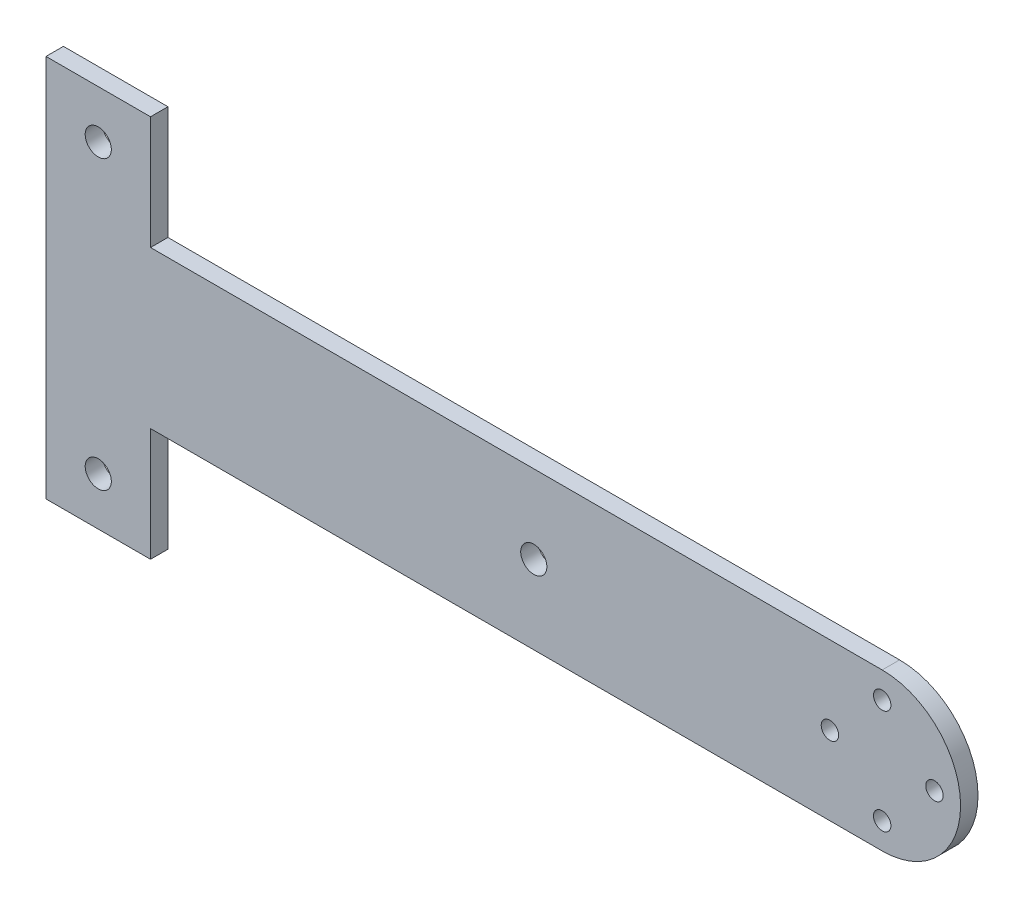
ISO-10303-21;
HEADER;
FILE_DESCRIPTION(('STEP AP214'),'2;1');
FILE_NAME('part.step','',(''),(''),'','','');
FILE_SCHEMA(('AUTOMOTIVE_DESIGN { 1 0 10303 214 1 1 1 1 }'));
ENDSEC;
DATA;
#1=APPLICATION_CONTEXT('core data for automotive mechanical design processes');
#2=APPLICATION_PROTOCOL_DEFINITION('international standard','automotive_design',2000,#1);
#3=PRODUCT_CONTEXT('',#1,'mechanical');
#4=PRODUCT('Part','Part','',(#3));
#5=PRODUCT_RELATED_PRODUCT_CATEGORY('part','',(#4));
#6=PRODUCT_DEFINITION_FORMATION('','',#4);
#7=PRODUCT_DEFINITION_CONTEXT('part definition',#1,'design');
#8=PRODUCT_DEFINITION('design','',#6,#7);
#9=PRODUCT_DEFINITION_SHAPE('','',#8);
#10=(LENGTH_UNIT() NAMED_UNIT(*) SI_UNIT(.MILLI.,.METRE.));
#11=(NAMED_UNIT(*) PLANE_ANGLE_UNIT() SI_UNIT($,.RADIAN.));
#12=(NAMED_UNIT(*) SI_UNIT($,.STERADIAN.) SOLID_ANGLE_UNIT());
#13=UNCERTAINTY_MEASURE_WITH_UNIT(LENGTH_MEASURE(1.E-05),#10,'distance_accuracy_value','');
#14=(GEOMETRIC_REPRESENTATION_CONTEXT(3) GLOBAL_UNCERTAINTY_ASSIGNED_CONTEXT((#13)) GLOBAL_UNIT_ASSIGNED_CONTEXT((#10,
#11,#12)) REPRESENTATION_CONTEXT('',''));
#15=CARTESIAN_POINT('',(0.,0.,0.));
#16=DIRECTION('',(0.,0.,1.));
#17=DIRECTION('',(1.,0.,0.));
#18=AXIS2_PLACEMENT_3D('',#15,#16,#17);
#19=CARTESIAN_POINT('',(41.2764285714286,0.145714285714315,2.));
#20=DIRECTION('',(0.,0.,-1.));
#21=DIRECTION('',(-1.,0.,0.));
#22=AXIS2_PLACEMENT_3D('',#19,#20,#21);
#23=CYLINDRICAL_SURFACE('',#22,9.);
#24=CARTESIAN_POINT('',(41.2764285714286,0.145714285714315,0.));
#25=DIRECTION('',(0.,0.,1.));
#26=DIRECTION('',(1.,0.,0.));
#27=AXIS2_PLACEMENT_3D('',#24,#25,#26);
#28=CIRCLE('',#27,9.);
#29=CARTESIAN_POINT('',(41.2764285714286,9.14571428571432,0.));
#30=VERTEX_POINT('',#29);
#31=CARTESIAN_POINT('',(41.2764285714286,-8.85428571428569,0.));
#32=VERTEX_POINT('',#31);
#33=EDGE_CURVE('E168',#30,#32,#28,.F.);
#34=ORIENTED_EDGE('',*,*,#33,.F.);
#35=DIRECTION('',(0.,0.,-1.));
#36=VECTOR('',#35,1.);
#37=CARTESIAN_POINT('',(41.2764285714286,9.14571428571432,2.));
#38=LINE('',#37,#36);
#39=CARTESIAN_POINT('',(41.2764285714286,9.14571428571432,2.));
#40=VERTEX_POINT('',#39);
#41=EDGE_CURVE('E11',#40,#30,#38,.T.);
#42=ORIENTED_EDGE('',*,*,#41,.F.);
#43=CARTESIAN_POINT('',(41.2764285714286,0.145714285714315,2.));
#44=DIRECTION('',(0.,0.,1.));
#45=DIRECTION('',(1.,0.,0.));
#46=AXIS2_PLACEMENT_3D('',#43,#44,#45);
#47=CIRCLE('',#46,9.);
#48=CARTESIAN_POINT('',(41.2764285714286,-8.85428571428569,2.));
#49=VERTEX_POINT('',#48);
#50=EDGE_CURVE('E297',#40,#49,#47,.F.);
#51=ORIENTED_EDGE('',*,*,#50,.T.);
#52=DIRECTION('',(0.,0.,-1.));
#53=VECTOR('',#52,1.);
#54=CARTESIAN_POINT('',(41.2764285714286,-8.85428571428569,2.));
#55=LINE('',#54,#53);
#56=EDGE_CURVE('E59',#49,#32,#55,.T.);
#57=ORIENTED_EDGE('',*,*,#56,.T.);
#58=EDGE_LOOP('',(#34,#42,#51,#57));
#59=FACE_BOUND('',#58,.T.);
#60=ADVANCED_FACE('F41',(#59),#23,.T.);
#61=CARTESIAN_POINT('',(0.,9.14571428571431,2.));
#62=DIRECTION('',(0.,-1.,0.));
#63=DIRECTION('',(1.,0.,0.));
#64=AXIS2_PLACEMENT_3D('',#61,#62,#63);
#65=PLANE('',#64);
#66=DIRECTION('',(-1.,0.,0.));
#67=VECTOR('',#66,1.);
#68=CARTESIAN_POINT('',(0.,9.14571428571431,0.));
#69=LINE('',#68,#67);
#70=CARTESIAN_POINT('',(-42.7235714285714,9.14571428571431,0.));
#71=VERTEX_POINT('',#70);
#72=EDGE_CURVE('E164',#30,#71,#69,.T.);
#73=ORIENTED_EDGE('',*,*,#72,.T.);
#74=DIRECTION('',(0.,0.,-1.));
#75=VECTOR('',#74,1.);
#76=CARTESIAN_POINT('',(-42.7235714285714,9.14571428571431,2.));
#77=LINE('',#76,#75);
#78=CARTESIAN_POINT('',(-42.7235714285714,9.14571428571431,2.));
#79=VERTEX_POINT('',#78);
#80=EDGE_CURVE('E51',#79,#71,#77,.T.);
#81=ORIENTED_EDGE('',*,*,#80,.F.);
#82=DIRECTION('',(-1.,0.,0.));
#83=VECTOR('',#82,1.);
#84=CARTESIAN_POINT('',(0.,9.14571428571431,2.));
#85=LINE('',#84,#83);
#86=EDGE_CURVE('E300',#40,#79,#85,.T.);
#87=ORIENTED_EDGE('',*,*,#86,.F.);
#88=ORIENTED_EDGE('',*,*,#41,.T.);
#89=EDGE_LOOP('',(#73,#81,#87,#88));
#90=FACE_BOUND('',#89,.T.);
#91=ADVANCED_FACE('F165',(#90),#65,.F.);
#92=CARTESIAN_POINT('',(-42.7235714285714,0.,2.));
#93=DIRECTION('',(-1.,0.,0.));
#94=DIRECTION('',(0.,0.,1.));
#95=AXIS2_PLACEMENT_3D('',#92,#93,#94);
#96=PLANE('',#95);
#97=DIRECTION('',(0.,1.,0.));
#98=VECTOR('',#97,1.);
#99=CARTESIAN_POINT('',(-42.7235714285714,0.,0.));
#100=LINE('',#99,#98);
#101=CARTESIAN_POINT('',(-42.7235714285714,22.1457142857143,0.));
#102=VERTEX_POINT('',#101);
#103=EDGE_CURVE('E158',#71,#102,#100,.T.);
#104=ORIENTED_EDGE('',*,*,#103,.T.);
#105=DIRECTION('',(0.,0.,-1.));
#106=VECTOR('',#105,1.);
#107=CARTESIAN_POINT('',(-42.7235714285714,22.1457142857143,2.));
#108=LINE('',#107,#106);
#109=CARTESIAN_POINT('',(-42.7235714285714,22.1457142857143,2.));
#110=VERTEX_POINT('',#109);
#111=EDGE_CURVE('E147',#110,#102,#108,.T.);
#112=ORIENTED_EDGE('',*,*,#111,.F.);
#113=DIRECTION('',(0.,1.,0.));
#114=VECTOR('',#113,1.);
#115=CARTESIAN_POINT('',(-42.7235714285714,0.,2.));
#116=LINE('',#115,#114);
#117=EDGE_CURVE('E160',#79,#110,#116,.T.);
#118=ORIENTED_EDGE('',*,*,#117,.F.);
#119=ORIENTED_EDGE('',*,*,#80,.T.);
#120=EDGE_LOOP('',(#104,#112,#118,#119));
#121=FACE_BOUND('',#120,.T.);
#122=ADVANCED_FACE('F156',(#121),#96,.F.);
#123=CARTESIAN_POINT('',(0.,22.1457142857143,2.));
#124=DIRECTION('',(0.,-1.,0.));
#125=DIRECTION('',(0.,0.,-1.));
#126=AXIS2_PLACEMENT_3D('',#123,#124,#125);
#127=PLANE('',#126);
#128=DIRECTION('',(-1.,0.,0.));
#129=VECTOR('',#128,1.);
#130=CARTESIAN_POINT('',(0.,22.1457142857143,0.));
#131=LINE('',#130,#129);
#132=CARTESIAN_POINT('',(-54.7235714285714,22.1457142857143,0.));
#133=VERTEX_POINT('',#132);
#134=EDGE_CURVE('E172',#102,#133,#131,.T.);
#135=ORIENTED_EDGE('',*,*,#134,.T.);
#136=DIRECTION('',(0.,0.,-1.));
#137=VECTOR('',#136,1.);
#138=CARTESIAN_POINT('',(-54.7235714285714,22.1457142857143,2.));
#139=LINE('',#138,#137);
#140=CARTESIAN_POINT('',(-54.7235714285714,22.1457142857143,2.));
#141=VERTEX_POINT('',#140);
#142=EDGE_CURVE('E139',#141,#133,#139,.T.);
#143=ORIENTED_EDGE('',*,*,#142,.F.);
#144=DIRECTION('',(-1.,0.,0.));
#145=VECTOR('',#144,1.);
#146=CARTESIAN_POINT('',(0.,22.1457142857143,2.));
#147=LINE('',#146,#145);
#148=EDGE_CURVE('E307',#110,#141,#147,.T.);
#149=ORIENTED_EDGE('',*,*,#148,.F.);
#150=ORIENTED_EDGE('',*,*,#111,.T.);
#151=EDGE_LOOP('',(#135,#143,#149,#150));
#152=FACE_BOUND('',#151,.T.);
#153=ADVANCED_FACE('F258',(#152),#127,.F.);
#154=CARTESIAN_POINT('',(-54.7235714285714,0.,2.));
#155=DIRECTION('',(1.,0.,0.));
#156=DIRECTION('',(0.,0.,-1.));
#157=AXIS2_PLACEMENT_3D('',#154,#155,#156);
#158=PLANE('',#157);
#159=DIRECTION('',(0.,-1.,0.));
#160=VECTOR('',#159,1.);
#161=CARTESIAN_POINT('',(-54.7235714285714,0.,0.));
#162=LINE('',#161,#160);
#163=CARTESIAN_POINT('',(-54.7235714285714,-21.8542857142857,0.));
#164=VERTEX_POINT('',#163);
#165=EDGE_CURVE('E181',#133,#164,#162,.T.);
#166=ORIENTED_EDGE('',*,*,#165,.T.);
#167=DIRECTION('',(0.,0.,-1.));
#168=VECTOR('',#167,1.);
#169=CARTESIAN_POINT('',(-54.7235714285714,-21.8542857142857,2.));
#170=LINE('',#169,#168);
#171=CARTESIAN_POINT('',(-54.7235714285714,-21.8542857142857,2.));
#172=VERTEX_POINT('',#171);
#173=EDGE_CURVE('E135',#172,#164,#170,.T.);
#174=ORIENTED_EDGE('',*,*,#173,.F.);
#175=DIRECTION('',(0.,-1.,0.));
#176=VECTOR('',#175,1.);
#177=CARTESIAN_POINT('',(-54.7235714285714,0.,2.));
#178=LINE('',#177,#176);
#179=EDGE_CURVE('E126',#141,#172,#178,.T.);
#180=ORIENTED_EDGE('',*,*,#179,.F.);
#181=ORIENTED_EDGE('',*,*,#142,.T.);
#182=EDGE_LOOP('',(#166,#174,#180,#181));
#183=FACE_BOUND('',#182,.T.);
#184=ADVANCED_FACE('F261',(#183),#158,.F.);
#185=CARTESIAN_POINT('',(0.,-21.8542857142857,2.));
#186=DIRECTION('',(0.,1.,0.));
#187=DIRECTION('',(0.,0.,1.));
#188=AXIS2_PLACEMENT_3D('',#185,#186,#187);
#189=PLANE('',#188);
#190=DIRECTION('',(1.,0.,0.));
#191=VECTOR('',#190,1.);
#192=CARTESIAN_POINT('',(0.,-21.8542857142857,0.));
#193=LINE('',#192,#191);
#194=CARTESIAN_POINT('',(-42.7235714285714,-21.8542857142857,0.));
#195=VERTEX_POINT('',#194);
#196=EDGE_CURVE('E133',#164,#195,#193,.T.);
#197=ORIENTED_EDGE('',*,*,#196,.T.);
#198=DIRECTION('',(0.,0.,-1.));
#199=VECTOR('',#198,1.);
#200=CARTESIAN_POINT('',(-42.7235714285714,-21.8542857142857,2.));
#201=LINE('',#200,#199);
#202=CARTESIAN_POINT('',(-42.7235714285714,-21.8542857142857,2.));
#203=VERTEX_POINT('',#202);
#204=EDGE_CURVE('E113',#203,#195,#201,.T.);
#205=ORIENTED_EDGE('',*,*,#204,.F.);
#206=DIRECTION('',(1.,0.,0.));
#207=VECTOR('',#206,1.);
#208=CARTESIAN_POINT('',(0.,-21.8542857142857,2.));
#209=LINE('',#208,#207);
#210=EDGE_CURVE('E119',#172,#203,#209,.T.);
#211=ORIENTED_EDGE('',*,*,#210,.F.);
#212=ORIENTED_EDGE('',*,*,#173,.T.);
#213=EDGE_LOOP('',(#197,#205,#211,#212));
#214=FACE_BOUND('',#213,.T.);
#215=ADVANCED_FACE('F132',(#214),#189,.F.);
#216=CARTESIAN_POINT('',(-42.7235714285714,0.,2.));
#217=DIRECTION('',(-1.,0.,0.));
#218=DIRECTION('',(0.,-1.,0.));
#219=AXIS2_PLACEMENT_3D('',#216,#217,#218);
#220=PLANE('',#219);
#221=DIRECTION('',(0.,1.,0.));
#222=VECTOR('',#221,1.);
#223=CARTESIAN_POINT('',(-42.7235714285714,0.,0.));
#224=LINE('',#223,#222);
#225=CARTESIAN_POINT('',(-42.7235714285714,-8.8542857142857,0.));
#226=VERTEX_POINT('',#225);
#227=EDGE_CURVE('E187',#195,#226,#224,.T.);
#228=ORIENTED_EDGE('',*,*,#227,.T.);
#229=DIRECTION('',(0.,0.,-1.));
#230=VECTOR('',#229,1.);
#231=CARTESIAN_POINT('',(-42.7235714285714,-8.8542857142857,2.));
#232=LINE('',#231,#230);
#233=CARTESIAN_POINT('',(-42.7235714285714,-8.8542857142857,2.));
#234=VERTEX_POINT('',#233);
#235=EDGE_CURVE('E85',#234,#226,#232,.T.);
#236=ORIENTED_EDGE('',*,*,#235,.F.);
#237=DIRECTION('',(0.,1.,0.));
#238=VECTOR('',#237,1.);
#239=CARTESIAN_POINT('',(-42.7235714285714,0.,2.));
#240=LINE('',#239,#238);
#241=EDGE_CURVE('E109',#203,#234,#240,.T.);
#242=ORIENTED_EDGE('',*,*,#241,.F.);
#243=ORIENTED_EDGE('',*,*,#204,.T.);
#244=EDGE_LOOP('',(#228,#236,#242,#243));
#245=FACE_BOUND('',#244,.T.);
#246=ADVANCED_FACE('F111',(#245),#220,.F.);
#247=CARTESIAN_POINT('',(-48.7235714285714,16.6457142857143,2.));
#248=DIRECTION('',(0.,0.,-1.));
#249=DIRECTION('',(-1.,0.,0.));
#250=AXIS2_PLACEMENT_3D('',#247,#248,#249);
#251=CYLINDRICAL_SURFACE('',#250,1.50000000000002);
#252=CARTESIAN_POINT('',(-48.7235714285714,16.6457142857143,2.));
#253=DIRECTION('',(0.,0.,1.));
#254=DIRECTION('',(1.,0.,0.));
#255=AXIS2_PLACEMENT_3D('',#252,#253,#254);
#256=CIRCLE('',#255,1.50000000000002);
#257=CARTESIAN_POINT('',(-47.2235714285714,16.6457142857143,2.));
#258=VERTEX_POINT('',#257);
#259=EDGE_CURVE('E222',#258,#258,#256,.T.);
#260=ORIENTED_EDGE('',*,*,#259,.T.);
#261=EDGE_LOOP('',(#260));
#262=FACE_BOUND('',#261,.T.);
#263=CARTESIAN_POINT('',(-48.7235714285714,16.6457142857143,0.));
#264=DIRECTION('',(0.,0.,1.));
#265=DIRECTION('',(1.,0.,0.));
#266=AXIS2_PLACEMENT_3D('',#263,#264,#265);
#267=CIRCLE('',#266,1.50000000000002);
#268=CARTESIAN_POINT('',(-47.2235714285714,16.6457142857143,0.));
#269=VERTEX_POINT('',#268);
#270=EDGE_CURVE('E210',#269,#269,#267,.T.);
#271=ORIENTED_EDGE('',*,*,#270,.F.);
#272=EDGE_LOOP('',(#271));
#273=FACE_BOUND('',#272,.T.);
#274=ADVANCED_FACE('F269',(#262,#273),#251,.F.);
#275=CARTESIAN_POINT('',(1.27642857142862,0.145714285714315,2.));
#276=DIRECTION('',(0.,0.,-1.));
#277=DIRECTION('',(-1.,0.,0.));
#278=AXIS2_PLACEMENT_3D('',#275,#276,#277);
#279=CYLINDRICAL_SURFACE('',#278,1.50000000000002);
#280=CARTESIAN_POINT('',(1.27642857142862,0.145714285714315,2.));
#281=DIRECTION('',(0.,0.,1.));
#282=DIRECTION('',(1.,0.,0.));
#283=AXIS2_PLACEMENT_3D('',#280,#281,#282);
#284=CIRCLE('',#283,1.50000000000002);
#285=CARTESIAN_POINT('',(2.77642857142865,0.145714285714315,2.));
#286=VERTEX_POINT('',#285);
#287=EDGE_CURVE('E228',#286,#286,#284,.T.);
#288=ORIENTED_EDGE('',*,*,#287,.T.);
#289=EDGE_LOOP('',(#288));
#290=FACE_BOUND('',#289,.T.);
#291=CARTESIAN_POINT('',(1.27642857142862,0.145714285714315,0.));
#292=DIRECTION('',(0.,0.,1.));
#293=DIRECTION('',(1.,0.,0.));
#294=AXIS2_PLACEMENT_3D('',#291,#292,#293);
#295=CIRCLE('',#294,1.50000000000002);
#296=CARTESIAN_POINT('',(2.77642857142865,0.145714285714315,0.));
#297=VERTEX_POINT('',#296);
#298=EDGE_CURVE('E206',#297,#297,#295,.T.);
#299=ORIENTED_EDGE('',*,*,#298,.F.);
#300=EDGE_LOOP('',(#299));
#301=FACE_BOUND('',#300,.T.);
#302=ADVANCED_FACE('F281',(#290,#301),#279,.F.);
#303=CARTESIAN_POINT('',(47.2764285714288,0.145714285714464,2.));
#304=DIRECTION('',(0.,0.,-1.));
#305=DIRECTION('',(-1.,0.,0.));
#306=AXIS2_PLACEMENT_3D('',#303,#304,#305);
#307=CYLINDRICAL_SURFACE('',#306,0.999999999999998);
#308=CARTESIAN_POINT('',(47.2764285714288,0.145714285714464,2.));
#309=DIRECTION('',(0.,0.,1.));
#310=DIRECTION('',(1.,0.,0.));
#311=AXIS2_PLACEMENT_3D('',#308,#309,#310);
#312=CIRCLE('',#311,0.999999999999998);
#313=CARTESIAN_POINT('',(48.2764285714288,0.145714285714464,2.));
#314=VERTEX_POINT('',#313);
#315=EDGE_CURVE('E322',#314,#314,#312,.T.);
#316=ORIENTED_EDGE('',*,*,#315,.T.);
#317=EDGE_LOOP('',(#316));
#318=FACE_BOUND('',#317,.T.);
#319=CARTESIAN_POINT('',(47.2764285714288,0.145714285714464,0.));
#320=DIRECTION('',(0.,0.,1.));
#321=DIRECTION('',(1.,0.,0.));
#322=AXIS2_PLACEMENT_3D('',#319,#320,#321);
#323=CIRCLE('',#322,0.999999999999998);
#324=CARTESIAN_POINT('',(48.2764285714288,0.145714285714464,0.));
#325=VERTEX_POINT('',#324);
#326=EDGE_CURVE('E202',#325,#325,#323,.T.);
#327=ORIENTED_EDGE('',*,*,#326,.F.);
#328=EDGE_LOOP('',(#327));
#329=FACE_BOUND('',#328,.T.);
#330=ADVANCED_FACE('F277',(#318,#329),#307,.F.);
#331=CARTESIAN_POINT('',(41.2764285714289,-5.85428571428569,2.));
#332=DIRECTION('',(0.,0.,-1.));
#333=DIRECTION('',(-1.,0.,0.));
#334=AXIS2_PLACEMENT_3D('',#331,#332,#333);
#335=CYLINDRICAL_SURFACE('',#334,0.999999999999998);
#336=CARTESIAN_POINT('',(41.2764285714289,-5.85428571428569,2.));
#337=DIRECTION('',(0.,0.,1.));
#338=DIRECTION('',(1.,0.,0.));
#339=AXIS2_PLACEMENT_3D('',#336,#337,#338);
#340=CIRCLE('',#339,0.999999999999998);
#341=CARTESIAN_POINT('',(42.2764285714289,-5.85428571428569,2.));
#342=VERTEX_POINT('',#341);
#343=EDGE_CURVE('E318',#342,#342,#340,.T.);
#344=ORIENTED_EDGE('',*,*,#343,.T.);
#345=EDGE_LOOP('',(#344));
#346=FACE_BOUND('',#345,.T.);
#347=CARTESIAN_POINT('',(41.2764285714289,-5.85428571428569,0.));
#348=DIRECTION('',(0.,0.,1.));
#349=DIRECTION('',(1.,0.,0.));
#350=AXIS2_PLACEMENT_3D('',#347,#348,#349);
#351=CIRCLE('',#350,0.999999999999998);
#352=CARTESIAN_POINT('',(42.2764285714289,-5.85428571428569,0.));
#353=VERTEX_POINT('',#352);
#354=EDGE_CURVE('E198',#353,#353,#351,.T.);
#355=ORIENTED_EDGE('',*,*,#354,.F.);
#356=EDGE_LOOP('',(#355));
#357=FACE_BOUND('',#356,.T.);
#358=ADVANCED_FACE('F273',(#346,#357),#335,.F.);
#359=CARTESIAN_POINT('',(35.2764285714288,0.145714285714214,2.));
#360=DIRECTION('',(0.,0.,-1.));
#361=DIRECTION('',(-1.,0.,0.));
#362=AXIS2_PLACEMENT_3D('',#359,#360,#361);
#363=CYLINDRICAL_SURFACE('',#362,0.999999999999998);
#364=CARTESIAN_POINT('',(35.2764285714288,0.145714285714214,2.));
#365=DIRECTION('',(0.,0.,1.));
#366=DIRECTION('',(1.,0.,0.));
#367=AXIS2_PLACEMENT_3D('',#364,#365,#366);
#368=CIRCLE('',#367,0.999999999999998);
#369=CARTESIAN_POINT('',(36.2764285714288,0.145714285714214,2.));
#370=VERTEX_POINT('',#369);
#371=EDGE_CURVE('E314',#370,#370,#368,.T.);
#372=ORIENTED_EDGE('',*,*,#371,.T.);
#373=EDGE_LOOP('',(#372));
#374=FACE_BOUND('',#373,.T.);
#375=CARTESIAN_POINT('',(35.2764285714288,0.145714285714214,0.));
#376=DIRECTION('',(0.,0.,1.));
#377=DIRECTION('',(1.,0.,0.));
#378=AXIS2_PLACEMENT_3D('',#375,#376,#377);
#379=CIRCLE('',#378,0.999999999999998);
#380=CARTESIAN_POINT('',(36.2764285714288,0.145714285714214,0.));
#381=VERTEX_POINT('',#380);
#382=EDGE_CURVE('E194',#381,#381,#379,.T.);
#383=ORIENTED_EDGE('',*,*,#382,.F.);
#384=EDGE_LOOP('',(#383));
#385=FACE_BOUND('',#384,.T.);
#386=ADVANCED_FACE('F247',(#374,#385),#363,.F.);
#387=CARTESIAN_POINT('',(0.,-8.85428571428569,2.));
#388=DIRECTION('',(0.,-1.,0.));
#389=DIRECTION('',(1.,0.,0.));
#390=AXIS2_PLACEMENT_3D('',#387,#388,#389);
#391=PLANE('',#390);
#392=DIRECTION('',(-1.,0.,0.));
#393=VECTOR('',#392,1.);
#394=CARTESIAN_POINT('',(0.,-8.85428571428569,0.));
#395=LINE('',#394,#393);
#396=EDGE_CURVE('E190',#32,#226,#395,.T.);
#397=ORIENTED_EDGE('',*,*,#396,.F.);
#398=ORIENTED_EDGE('',*,*,#56,.F.);
#399=DIRECTION('',(-1.,0.,0.));
#400=VECTOR('',#399,1.);
#401=CARTESIAN_POINT('',(0.,-8.85428571428569,2.));
#402=LINE('',#401,#400);
#403=EDGE_CURVE('E118',#49,#234,#402,.T.);
#404=ORIENTED_EDGE('',*,*,#403,.T.);
#405=ORIENTED_EDGE('',*,*,#235,.T.);
#406=EDGE_LOOP('',(#397,#398,#404,#405));
#407=FACE_BOUND('',#406,.T.);
#408=ADVANCED_FACE('F239',(#407),#391,.T.);
#409=CARTESIAN_POINT('',(41.2764285714286,6.14571428571432,2.));
#410=DIRECTION('',(0.,0.,-1.));
#411=DIRECTION('',(-1.,0.,0.));
#412=AXIS2_PLACEMENT_3D('',#409,#410,#411);
#413=CYLINDRICAL_SURFACE('',#412,0.999999999999998);
#414=CARTESIAN_POINT('',(41.2764285714286,6.14571428571432,2.));
#415=DIRECTION('',(0.,0.,1.));
#416=DIRECTION('',(1.,0.,0.));
#417=AXIS2_PLACEMENT_3D('',#414,#415,#416);
#418=CIRCLE('',#417,0.999999999999998);
#419=CARTESIAN_POINT('',(42.2764285714286,6.14571428571432,2.));
#420=VERTEX_POINT('',#419);
#421=EDGE_CURVE('E217',#420,#420,#418,.T.);
#422=ORIENTED_EDGE('',*,*,#421,.T.);
#423=EDGE_LOOP('',(#422));
#424=FACE_BOUND('',#423,.T.);
#425=CARTESIAN_POINT('',(41.2764285714286,6.14571428571432,0.));
#426=DIRECTION('',(0.,0.,1.));
#427=DIRECTION('',(1.,0.,0.));
#428=AXIS2_PLACEMENT_3D('',#425,#426,#427);
#429=CIRCLE('',#428,0.999999999999998);
#430=CARTESIAN_POINT('',(42.2764285714286,6.14571428571432,0.));
#431=VERTEX_POINT('',#430);
#432=EDGE_CURVE('E174',#431,#431,#429,.T.);
#433=ORIENTED_EDGE('',*,*,#432,.F.);
#434=EDGE_LOOP('',(#433));
#435=FACE_BOUND('',#434,.T.);
#436=ADVANCED_FACE('F43',(#424,#435),#413,.F.);
#437=CARTESIAN_POINT('',(-48.7235714285714,-16.3542857142857,2.));
#438=DIRECTION('',(0.,0.,-1.));
#439=DIRECTION('',(-1.,0.,0.));
#440=AXIS2_PLACEMENT_3D('',#437,#438,#439);
#441=CYLINDRICAL_SURFACE('',#440,1.50000000000002);
#442=CARTESIAN_POINT('',(-48.7235714285714,-16.3542857142857,2.));
#443=DIRECTION('',(0.,0.,1.));
#444=DIRECTION('',(1.,0.,0.));
#445=AXIS2_PLACEMENT_3D('',#442,#443,#444);
#446=CIRCLE('',#445,1.50000000000002);
#447=CARTESIAN_POINT('',(-47.2235714285714,-16.3542857142857,2.));
#448=VERTEX_POINT('',#447);
#449=EDGE_CURVE('E219',#448,#448,#446,.F.);
#450=ORIENTED_EDGE('',*,*,#449,.F.);
#451=EDGE_LOOP('',(#450));
#452=FACE_BOUND('',#451,.T.);
#453=CARTESIAN_POINT('',(-48.7235714285714,-16.3542857142857,0.));
#454=DIRECTION('',(0.,0.,1.));
#455=DIRECTION('',(1.,0.,0.));
#456=AXIS2_PLACEMENT_3D('',#453,#454,#455);
#457=CIRCLE('',#456,1.50000000000002);
#458=CARTESIAN_POINT('',(-47.2235714285714,-16.3542857142857,0.));
#459=VERTEX_POINT('',#458);
#460=EDGE_CURVE('E214',#459,#459,#457,.F.);
#461=ORIENTED_EDGE('',*,*,#460,.T.);
#462=EDGE_LOOP('',(#461));
#463=FACE_BOUND('',#462,.T.);
#464=ADVANCED_FACE('F238',(#452,#463),#441,.F.);
#465=CARTESIAN_POINT('',(0.,0.,2.));
#466=DIRECTION('',(0.,0.,1.));
#467=DIRECTION('',(1.,0.,0.));
#468=AXIS2_PLACEMENT_3D('',#465,#466,#467);
#469=PLANE('',#468);
#470=ORIENTED_EDGE('',*,*,#421,.F.);
#471=EDGE_LOOP('',(#470));
#472=FACE_BOUND('',#471,.T.);
#473=ORIENTED_EDGE('',*,*,#50,.F.);
#474=ORIENTED_EDGE('',*,*,#86,.T.);
#475=ORIENTED_EDGE('',*,*,#117,.T.);
#476=ORIENTED_EDGE('',*,*,#148,.T.);
#477=ORIENTED_EDGE('',*,*,#179,.T.);
#478=ORIENTED_EDGE('',*,*,#210,.T.);
#479=ORIENTED_EDGE('',*,*,#241,.T.);
#480=ORIENTED_EDGE('',*,*,#403,.F.);
#481=EDGE_LOOP('',(#473,#474,#475,#476,#477,#478,#479,#480));
#482=FACE_BOUND('',#481,.T.);
#483=ORIENTED_EDGE('',*,*,#371,.F.);
#484=EDGE_LOOP('',(#483));
#485=FACE_BOUND('',#484,.T.);
#486=ORIENTED_EDGE('',*,*,#343,.F.);
#487=EDGE_LOOP('',(#486));
#488=FACE_BOUND('',#487,.T.);
#489=ORIENTED_EDGE('',*,*,#315,.F.);
#490=EDGE_LOOP('',(#489));
#491=FACE_BOUND('',#490,.T.);
#492=ORIENTED_EDGE('',*,*,#287,.F.);
#493=EDGE_LOOP('',(#492));
#494=FACE_BOUND('',#493,.T.);
#495=ORIENTED_EDGE('',*,*,#259,.F.);
#496=EDGE_LOOP('',(#495));
#497=FACE_BOUND('',#496,.T.);
#498=ORIENTED_EDGE('',*,*,#449,.T.);
#499=EDGE_LOOP('',(#498));
#500=FACE_BOUND('',#499,.T.);
#501=ADVANCED_FACE('F123',(#472,#482,#485,#488,#491,#494,#497,#500),#469,.T.);
#502=CARTESIAN_POINT('',(0.,0.,0.));
#503=DIRECTION('',(0.,0.,1.));
#504=DIRECTION('',(1.,0.,0.));
#505=AXIS2_PLACEMENT_3D('',#502,#503,#504);
#506=PLANE('',#505);
#507=ORIENTED_EDGE('',*,*,#432,.T.);
#508=EDGE_LOOP('',(#507));
#509=FACE_BOUND('',#508,.T.);
#510=ORIENTED_EDGE('',*,*,#33,.T.);
#511=ORIENTED_EDGE('',*,*,#396,.T.);
#512=ORIENTED_EDGE('',*,*,#227,.F.);
#513=ORIENTED_EDGE('',*,*,#196,.F.);
#514=ORIENTED_EDGE('',*,*,#165,.F.);
#515=ORIENTED_EDGE('',*,*,#134,.F.);
#516=ORIENTED_EDGE('',*,*,#103,.F.);
#517=ORIENTED_EDGE('',*,*,#72,.F.);
#518=EDGE_LOOP('',(#510,#511,#512,#513,#514,#515,#516,#517));
#519=FACE_BOUND('',#518,.T.);
#520=ORIENTED_EDGE('',*,*,#382,.T.);
#521=EDGE_LOOP('',(#520));
#522=FACE_BOUND('',#521,.T.);
#523=ORIENTED_EDGE('',*,*,#354,.T.);
#524=EDGE_LOOP('',(#523));
#525=FACE_BOUND('',#524,.T.);
#526=ORIENTED_EDGE('',*,*,#326,.T.);
#527=EDGE_LOOP('',(#526));
#528=FACE_BOUND('',#527,.T.);
#529=ORIENTED_EDGE('',*,*,#298,.T.);
#530=EDGE_LOOP('',(#529));
#531=FACE_BOUND('',#530,.T.);
#532=ORIENTED_EDGE('',*,*,#270,.T.);
#533=EDGE_LOOP('',(#532));
#534=FACE_BOUND('',#533,.T.);
#535=ORIENTED_EDGE('',*,*,#460,.F.);
#536=EDGE_LOOP('',(#535));
#537=FACE_BOUND('',#536,.T.);
#538=ADVANCED_FACE('F235',(#509,#519,#522,#525,#528,#531,#534,#537),#506,.F.);
#539=CLOSED_SHELL('',(#60,#91,#122,#153,#184,#215,#246,#274,#302,#330,#358,#386,#408,#436,#464,
#501,#538));
#540=MANIFOLD_SOLID_BREP('B2',#539);
#541=ADVANCED_BREP_SHAPE_REPRESENTATION('',(#18,#540),#14);
#542=SHAPE_DEFINITION_REPRESENTATION(#9,#541);
ENDSEC;
END-ISO-10303-21;
